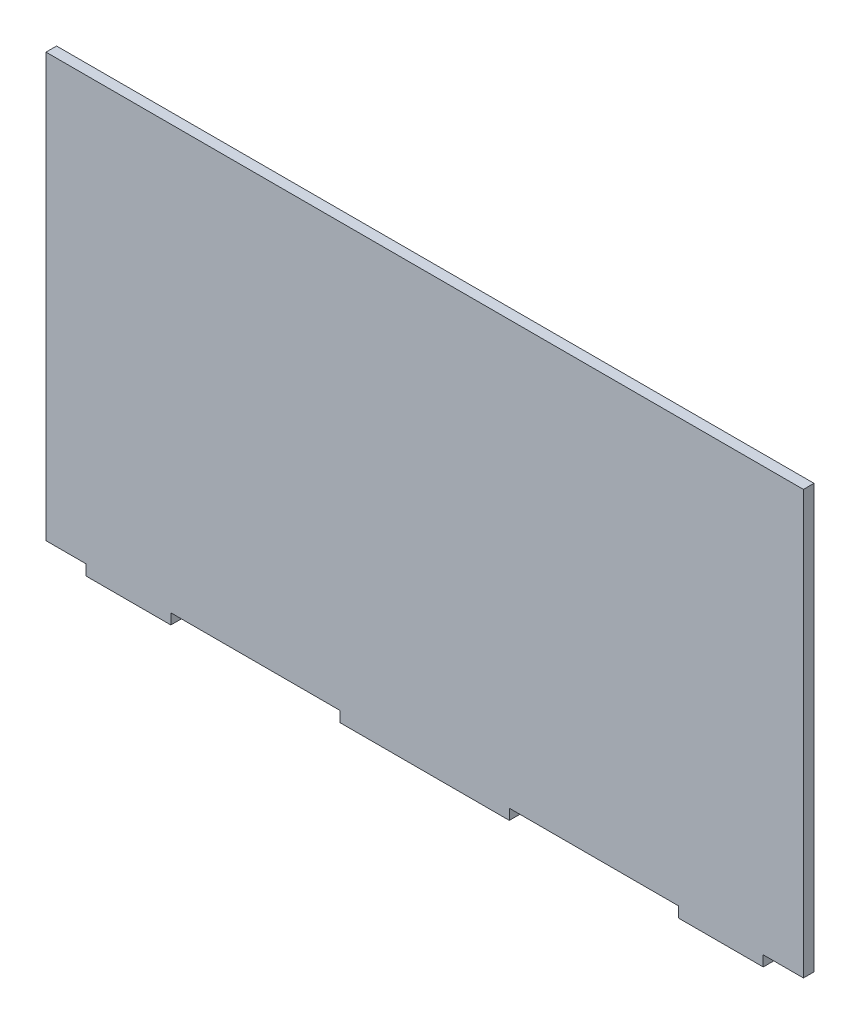
ISO-10303-21;
HEADER;
FILE_DESCRIPTION(('STEP AP214'),'2;1');
FILE_NAME('part.step','',(''),(''),'','','');
FILE_SCHEMA(('AUTOMOTIVE_DESIGN { 1 0 10303 214 1 1 1 1 }'));
ENDSEC;
DATA;
#1=APPLICATION_CONTEXT('core data for automotive mechanical design processes');
#2=APPLICATION_PROTOCOL_DEFINITION('international standard','automotive_design',2000,#1);
#3=PRODUCT_CONTEXT('',#1,'mechanical');
#4=PRODUCT('Part','Part','',(#3));
#5=PRODUCT_RELATED_PRODUCT_CATEGORY('part','',(#4));
#6=PRODUCT_DEFINITION_FORMATION('','',#4);
#7=PRODUCT_DEFINITION_CONTEXT('part definition',#1,'design');
#8=PRODUCT_DEFINITION('design','',#6,#7);
#9=PRODUCT_DEFINITION_SHAPE('','',#8);
#10=(LENGTH_UNIT() NAMED_UNIT(*) SI_UNIT(.MILLI.,.METRE.));
#11=(NAMED_UNIT(*) PLANE_ANGLE_UNIT() SI_UNIT($,.RADIAN.));
#12=(NAMED_UNIT(*) SI_UNIT($,.STERADIAN.) SOLID_ANGLE_UNIT());
#13=UNCERTAINTY_MEASURE_WITH_UNIT(LENGTH_MEASURE(1.E-05),#10,'distance_accuracy_value','');
#14=(GEOMETRIC_REPRESENTATION_CONTEXT(3) GLOBAL_UNCERTAINTY_ASSIGNED_CONTEXT((#13)) GLOBAL_UNIT_ASSIGNED_CONTEXT((#10,
#11,#12)) REPRESENTATION_CONTEXT('',''));
#15=CARTESIAN_POINT('',(0.,0.,0.));
#16=DIRECTION('',(0.,0.,1.));
#17=DIRECTION('',(1.,0.,0.));
#18=AXIS2_PLACEMENT_3D('',#15,#16,#17);
#19=CARTESIAN_POINT('',(-10.8986258338945,0.816744863215092,5.));
#20=DIRECTION('',(1.,0.,0.));
#21=DIRECTION('',(0.,0.,-1.));
#22=AXIS2_PLACEMENT_3D('',#19,#20,#21);
#23=PLANE('',#22);
#24=DIRECTION('',(0.,-1.,0.));
#25=VECTOR('',#24,1.);
#26=CARTESIAN_POINT('',(-10.8986258338945,0.816744863215092,0.));
#27=LINE('',#26,#25);
#28=CARTESIAN_POINT('',(-10.8986258338945,200.816744863215,0.));
#29=VERTEX_POINT('',#28);
#30=CARTESIAN_POINT('',(-10.8986258338945,0.816744863215092,0.));
#31=VERTEX_POINT('',#30);
#32=EDGE_CURVE('E194',#29,#31,#27,.T.);
#33=ORIENTED_EDGE('',*,*,#32,.T.);
#34=DIRECTION('',(0.,0.,-1.));
#35=VECTOR('',#34,1.);
#36=CARTESIAN_POINT('',(-10.8986258338945,0.816744863215092,5.));
#37=LINE('',#36,#35);
#38=CARTESIAN_POINT('',(-10.8986258338945,0.816744863215092,5.));
#39=VERTEX_POINT('',#38);
#40=EDGE_CURVE('E11',#39,#31,#37,.T.);
#41=ORIENTED_EDGE('',*,*,#40,.F.);
#42=DIRECTION('',(0.,-1.,0.));
#43=VECTOR('',#42,1.);
#44=CARTESIAN_POINT('',(-10.8986258338945,0.816744863215092,5.));
#45=LINE('',#44,#43);
#46=CARTESIAN_POINT('',(-10.8986258338945,200.816744863215,5.));
#47=VERTEX_POINT('',#46);
#48=EDGE_CURVE('E240',#47,#39,#45,.T.);
#49=ORIENTED_EDGE('',*,*,#48,.F.);
#50=DIRECTION('',(0.,0.,-1.));
#51=VECTOR('',#50,1.);
#52=CARTESIAN_POINT('',(-10.8986258338945,200.816744863215,5.));
#53=LINE('',#52,#51);
#54=EDGE_CURVE('E190',#47,#29,#53,.T.);
#55=ORIENTED_EDGE('',*,*,#54,.T.);
#56=EDGE_LOOP('',(#33,#41,#49,#55));
#57=FACE_BOUND('',#56,.T.);
#58=ADVANCED_FACE('F45',(#57),#23,.F.);
#59=CARTESIAN_POINT('',(-10.8986258338945,0.816744863215092,5.));
#60=DIRECTION('',(0.,1.,0.));
#61=DIRECTION('',(-1.,0.,0.));
#62=AXIS2_PLACEMENT_3D('',#59,#60,#61);
#63=PLANE('',#62);
#64=DIRECTION('',(1.,0.,0.));
#65=VECTOR('',#64,1.);
#66=CARTESIAN_POINT('',(-10.8986258338945,0.816744863215092,0.));
#67=LINE('',#66,#65);
#68=CARTESIAN_POINT('',(8.10137416610551,0.816744863215092,0.));
#69=VERTEX_POINT('',#68);
#70=EDGE_CURVE('E198',#31,#69,#67,.T.);
#71=ORIENTED_EDGE('',*,*,#70,.T.);
#72=DIRECTION('',(0.,0.,-1.));
#73=VECTOR('',#72,1.);
#74=CARTESIAN_POINT('',(8.10137416610551,0.816744863215092,5.));
#75=LINE('',#74,#73);
#76=CARTESIAN_POINT('',(8.10137416610551,0.816744863215092,5.));
#77=VERTEX_POINT('',#76);
#78=EDGE_CURVE('E54',#77,#69,#75,.T.);
#79=ORIENTED_EDGE('',*,*,#78,.F.);
#80=DIRECTION('',(1.,0.,0.));
#81=VECTOR('',#80,1.);
#82=CARTESIAN_POINT('',(-10.8986258338945,0.816744863215092,5.));
#83=LINE('',#82,#81);
#84=EDGE_CURVE('E129',#39,#77,#83,.T.);
#85=ORIENTED_EDGE('',*,*,#84,.F.);
#86=ORIENTED_EDGE('',*,*,#40,.T.);
#87=EDGE_LOOP('',(#71,#79,#85,#86));
#88=FACE_BOUND('',#87,.T.);
#89=ADVANCED_FACE('F362',(#88),#63,.F.);
#90=CARTESIAN_POINT('',(8.10137416610551,0.816744863215092,5.));
#91=DIRECTION('',(1.,0.,0.));
#92=DIRECTION('',(0.,0.,-1.));
#93=AXIS2_PLACEMENT_3D('',#90,#91,#92);
#94=PLANE('',#93);
#95=DIRECTION('',(0.,-1.,0.));
#96=VECTOR('',#95,1.);
#97=CARTESIAN_POINT('',(8.10137416610551,0.816744863215092,0.));
#98=LINE('',#97,#96);
#99=CARTESIAN_POINT('',(8.10137416610551,-4.18325513678491,0.));
#100=VERTEX_POINT('',#99);
#101=EDGE_CURVE('E201',#69,#100,#98,.T.);
#102=ORIENTED_EDGE('',*,*,#101,.T.);
#103=DIRECTION('',(0.,0.,-1.));
#104=VECTOR('',#103,1.);
#105=CARTESIAN_POINT('',(8.10137416610551,-4.18325513678491,5.));
#106=LINE('',#105,#104);
#107=CARTESIAN_POINT('',(8.10137416610551,-4.18325513678491,5.));
#108=VERTEX_POINT('',#107);
#109=EDGE_CURVE('E283',#108,#100,#106,.T.);
#110=ORIENTED_EDGE('',*,*,#109,.F.);
#111=DIRECTION('',(0.,-1.,0.));
#112=VECTOR('',#111,1.);
#113=CARTESIAN_POINT('',(8.10137416610551,0.816744863215092,5.));
#114=LINE('',#113,#112);
#115=EDGE_CURVE('E293',#77,#108,#114,.T.);
#116=ORIENTED_EDGE('',*,*,#115,.F.);
#117=ORIENTED_EDGE('',*,*,#78,.T.);
#118=EDGE_LOOP('',(#102,#110,#116,#117));
#119=FACE_BOUND('',#118,.T.);
#120=ADVANCED_FACE('F291',(#119),#94,.F.);
#121=CARTESIAN_POINT('',(8.10137416610551,-4.18325513678491,5.));
#122=DIRECTION('',(0.,1.,0.));
#123=DIRECTION('',(0.,0.,1.));
#124=AXIS2_PLACEMENT_3D('',#121,#122,#123);
#125=PLANE('',#124);
#126=DIRECTION('',(1.,0.,0.));
#127=VECTOR('',#126,1.);
#128=CARTESIAN_POINT('',(8.10137416610551,-4.18325513678491,0.));
#129=LINE('',#128,#127);
#130=CARTESIAN_POINT('',(48.1013741661055,-4.18325513678491,0.));
#131=VERTEX_POINT('',#130);
#132=EDGE_CURVE('E204',#100,#131,#129,.T.);
#133=ORIENTED_EDGE('',*,*,#132,.T.);
#134=DIRECTION('',(0.,0.,-1.));
#135=VECTOR('',#134,1.);
#136=CARTESIAN_POINT('',(48.1013741661055,-4.18325513678491,5.));
#137=LINE('',#136,#135);
#138=CARTESIAN_POINT('',(48.1013741661055,-4.18325513678491,5.));
#139=VERTEX_POINT('',#138);
#140=EDGE_CURVE('E279',#139,#131,#137,.T.);
#141=ORIENTED_EDGE('',*,*,#140,.F.);
#142=DIRECTION('',(1.,0.,0.));
#143=VECTOR('',#142,1.);
#144=CARTESIAN_POINT('',(8.10137416610551,-4.18325513678491,5.));
#145=LINE('',#144,#143);
#146=EDGE_CURVE('E312',#108,#139,#145,.T.);
#147=ORIENTED_EDGE('',*,*,#146,.F.);
#148=ORIENTED_EDGE('',*,*,#109,.T.);
#149=EDGE_LOOP('',(#133,#141,#147,#148));
#150=FACE_BOUND('',#149,.T.);
#151=ADVANCED_FACE('F302',(#150),#125,.F.);
#152=CARTESIAN_POINT('',(48.1013741661055,-4.18325513678491,5.));
#153=DIRECTION('',(-1.,0.,0.));
#154=DIRECTION('',(0.,0.,1.));
#155=AXIS2_PLACEMENT_3D('',#152,#153,#154);
#156=PLANE('',#155);
#157=DIRECTION('',(0.,1.,0.));
#158=VECTOR('',#157,1.);
#159=CARTESIAN_POINT('',(48.1013741661055,-4.18325513678491,0.));
#160=LINE('',#159,#158);
#161=CARTESIAN_POINT('',(48.1013741661055,0.816744863215091,0.));
#162=VERTEX_POINT('',#161);
#163=EDGE_CURVE('E207',#131,#162,#160,.T.);
#164=ORIENTED_EDGE('',*,*,#163,.T.);
#165=DIRECTION('',(0.,0.,-1.));
#166=VECTOR('',#165,1.);
#167=CARTESIAN_POINT('',(48.1013741661055,0.816744863215091,5.));
#168=LINE('',#167,#166);
#169=CARTESIAN_POINT('',(48.1013741661055,0.816744863215091,5.));
#170=VERTEX_POINT('',#169);
#171=EDGE_CURVE('E275',#170,#162,#168,.T.);
#172=ORIENTED_EDGE('',*,*,#171,.F.);
#173=DIRECTION('',(0.,1.,0.));
#174=VECTOR('',#173,1.);
#175=CARTESIAN_POINT('',(48.1013741661055,-4.18325513678491,5.));
#176=LINE('',#175,#174);
#177=EDGE_CURVE('E308',#139,#170,#176,.T.);
#178=ORIENTED_EDGE('',*,*,#177,.F.);
#179=ORIENTED_EDGE('',*,*,#140,.T.);
#180=EDGE_LOOP('',(#164,#172,#178,#179));
#181=FACE_BOUND('',#180,.T.);
#182=ADVANCED_FACE('F306',(#181),#156,.F.);
#183=CARTESIAN_POINT('',(48.1013741661055,0.816744863215091,5.));
#184=DIRECTION('',(0.,1.,0.));
#185=DIRECTION('',(0.,0.,1.));
#186=AXIS2_PLACEMENT_3D('',#183,#184,#185);
#187=PLANE('',#186);
#188=DIRECTION('',(1.,0.,0.));
#189=VECTOR('',#188,1.);
#190=CARTESIAN_POINT('',(48.1013741661055,0.816744863215091,0.));
#191=LINE('',#190,#189);
#192=CARTESIAN_POINT('',(128.101374166106,0.816744863215091,0.));
#193=VERTEX_POINT('',#192);
#194=EDGE_CURVE('E210',#162,#193,#191,.T.);
#195=ORIENTED_EDGE('',*,*,#194,.T.);
#196=DIRECTION('',(0.,0.,-1.));
#197=VECTOR('',#196,1.);
#198=CARTESIAN_POINT('',(128.101374166106,0.816744863215091,5.));
#199=LINE('',#198,#197);
#200=CARTESIAN_POINT('',(128.101374166106,0.816744863215091,5.));
#201=VERTEX_POINT('',#200);
#202=EDGE_CURVE('E271',#201,#193,#199,.T.);
#203=ORIENTED_EDGE('',*,*,#202,.F.);
#204=DIRECTION('',(1.,0.,0.));
#205=VECTOR('',#204,1.);
#206=CARTESIAN_POINT('',(48.1013741661055,0.816744863215091,5.));
#207=LINE('',#206,#205);
#208=EDGE_CURVE('E311',#170,#201,#207,.T.);
#209=ORIENTED_EDGE('',*,*,#208,.F.);
#210=ORIENTED_EDGE('',*,*,#171,.T.);
#211=EDGE_LOOP('',(#195,#203,#209,#210));
#212=FACE_BOUND('',#211,.T.);
#213=ADVANCED_FACE('F375',(#212),#187,.F.);
#214=CARTESIAN_POINT('',(128.101374166106,0.816744863215091,5.));
#215=DIRECTION('',(1.,0.,0.));
#216=DIRECTION('',(0.,0.,-1.));
#217=AXIS2_PLACEMENT_3D('',#214,#215,#216);
#218=PLANE('',#217);
#219=DIRECTION('',(0.,-1.,0.));
#220=VECTOR('',#219,1.);
#221=CARTESIAN_POINT('',(128.101374166106,0.816744863215091,0.));
#222=LINE('',#221,#220);
#223=CARTESIAN_POINT('',(128.101374166106,-4.18325513678491,0.));
#224=VERTEX_POINT('',#223);
#225=EDGE_CURVE('E213',#193,#224,#222,.T.);
#226=ORIENTED_EDGE('',*,*,#225,.T.);
#227=DIRECTION('',(0.,0.,-1.));
#228=VECTOR('',#227,1.);
#229=CARTESIAN_POINT('',(128.101374166106,-4.18325513678491,5.));
#230=LINE('',#229,#228);
#231=CARTESIAN_POINT('',(128.101374166106,-4.18325513678491,5.));
#232=VERTEX_POINT('',#231);
#233=EDGE_CURVE('E267',#232,#224,#230,.T.);
#234=ORIENTED_EDGE('',*,*,#233,.F.);
#235=DIRECTION('',(0.,-1.,0.));
#236=VECTOR('',#235,1.);
#237=CARTESIAN_POINT('',(128.101374166106,0.816744863215091,5.));
#238=LINE('',#237,#236);
#239=EDGE_CURVE('E316',#201,#232,#238,.T.);
#240=ORIENTED_EDGE('',*,*,#239,.F.);
#241=ORIENTED_EDGE('',*,*,#202,.T.);
#242=EDGE_LOOP('',(#226,#234,#240,#241));
#243=FACE_BOUND('',#242,.T.);
#244=ADVANCED_FACE('F378',(#243),#218,.F.);
#245=CARTESIAN_POINT('',(128.101374166106,-4.18325513678491,5.));
#246=DIRECTION('',(0.,1.,0.));
#247=DIRECTION('',(0.,0.,1.));
#248=AXIS2_PLACEMENT_3D('',#245,#246,#247);
#249=PLANE('',#248);
#250=DIRECTION('',(1.,0.,0.));
#251=VECTOR('',#250,1.);
#252=CARTESIAN_POINT('',(128.101374166106,-4.18325513678491,0.));
#253=LINE('',#252,#251);
#254=CARTESIAN_POINT('',(208.101374166106,-4.18325513678491,0.));
#255=VERTEX_POINT('',#254);
#256=EDGE_CURVE('E216',#224,#255,#253,.T.);
#257=ORIENTED_EDGE('',*,*,#256,.T.);
#258=DIRECTION('',(0.,0.,-1.));
#259=VECTOR('',#258,1.);
#260=CARTESIAN_POINT('',(208.101374166106,-4.18325513678491,5.));
#261=LINE('',#260,#259);
#262=CARTESIAN_POINT('',(208.101374166106,-4.18325513678491,5.));
#263=VERTEX_POINT('',#262);
#264=EDGE_CURVE('E263',#263,#255,#261,.T.);
#265=ORIENTED_EDGE('',*,*,#264,.F.);
#266=DIRECTION('',(1.,0.,0.));
#267=VECTOR('',#266,1.);
#268=CARTESIAN_POINT('',(128.101374166106,-4.18325513678491,5.));
#269=LINE('',#268,#267);
#270=EDGE_CURVE('E323',#232,#263,#269,.T.);
#271=ORIENTED_EDGE('',*,*,#270,.F.);
#272=ORIENTED_EDGE('',*,*,#233,.T.);
#273=EDGE_LOOP('',(#257,#265,#271,#272));
#274=FACE_BOUND('',#273,.T.);
#275=ADVANCED_FACE('F382',(#274),#249,.F.);
#276=CARTESIAN_POINT('',(208.101374166106,-4.18325513678491,5.));
#277=DIRECTION('',(-1.,0.,0.));
#278=DIRECTION('',(0.,0.,1.));
#279=AXIS2_PLACEMENT_3D('',#276,#277,#278);
#280=PLANE('',#279);
#281=DIRECTION('',(0.,1.,0.));
#282=VECTOR('',#281,1.);
#283=CARTESIAN_POINT('',(208.101374166106,-4.18325513678491,0.));
#284=LINE('',#283,#282);
#285=CARTESIAN_POINT('',(208.101374166106,0.816744863215092,0.));
#286=VERTEX_POINT('',#285);
#287=EDGE_CURVE('E219',#255,#286,#284,.T.);
#288=ORIENTED_EDGE('',*,*,#287,.T.);
#289=DIRECTION('',(0.,0.,-1.));
#290=VECTOR('',#289,1.);
#291=CARTESIAN_POINT('',(208.101374166106,0.816744863215092,5.));
#292=LINE('',#291,#290);
#293=CARTESIAN_POINT('',(208.101374166106,0.816744863215092,5.));
#294=VERTEX_POINT('',#293);
#295=EDGE_CURVE('E259',#294,#286,#292,.T.);
#296=ORIENTED_EDGE('',*,*,#295,.F.);
#297=DIRECTION('',(0.,1.,0.));
#298=VECTOR('',#297,1.);
#299=CARTESIAN_POINT('',(208.101374166106,-4.18325513678491,5.));
#300=LINE('',#299,#298);
#301=EDGE_CURVE('E326',#263,#294,#300,.T.);
#302=ORIENTED_EDGE('',*,*,#301,.F.);
#303=ORIENTED_EDGE('',*,*,#264,.T.);
#304=EDGE_LOOP('',(#288,#296,#302,#303));
#305=FACE_BOUND('',#304,.T.);
#306=ADVANCED_FACE('F386',(#305),#280,.F.);
#307=CARTESIAN_POINT('',(208.101374166106,0.816744863215092,5.));
#308=DIRECTION('',(0.,1.,0.));
#309=DIRECTION('',(0.,0.,1.));
#310=AXIS2_PLACEMENT_3D('',#307,#308,#309);
#311=PLANE('',#310);
#312=DIRECTION('',(1.,0.,0.));
#313=VECTOR('',#312,1.);
#314=CARTESIAN_POINT('',(208.101374166106,0.816744863215092,0.));
#315=LINE('',#314,#313);
#316=CARTESIAN_POINT('',(288.101374166106,0.816744863215092,0.));
#317=VERTEX_POINT('',#316);
#318=EDGE_CURVE('E222',#286,#317,#315,.T.);
#319=ORIENTED_EDGE('',*,*,#318,.T.);
#320=DIRECTION('',(0.,0.,-1.));
#321=VECTOR('',#320,1.);
#322=CARTESIAN_POINT('',(288.101374166106,0.816744863215092,5.));
#323=LINE('',#322,#321);
#324=CARTESIAN_POINT('',(288.101374166106,0.816744863215092,5.));
#325=VERTEX_POINT('',#324);
#326=EDGE_CURVE('E255',#325,#317,#323,.T.);
#327=ORIENTED_EDGE('',*,*,#326,.F.);
#328=DIRECTION('',(1.,0.,0.));
#329=VECTOR('',#328,1.);
#330=CARTESIAN_POINT('',(208.101374166106,0.816744863215092,5.));
#331=LINE('',#330,#329);
#332=EDGE_CURVE('E329',#294,#325,#331,.T.);
#333=ORIENTED_EDGE('',*,*,#332,.F.);
#334=ORIENTED_EDGE('',*,*,#295,.T.);
#335=EDGE_LOOP('',(#319,#327,#333,#334));
#336=FACE_BOUND('',#335,.T.);
#337=ADVANCED_FACE('F390',(#336),#311,.F.);
#338=CARTESIAN_POINT('',(288.101374166106,0.816744863215092,5.));
#339=DIRECTION('',(1.,0.,0.));
#340=DIRECTION('',(0.,0.,-1.));
#341=AXIS2_PLACEMENT_3D('',#338,#339,#340);
#342=PLANE('',#341);
#343=DIRECTION('',(0.,-1.,0.));
#344=VECTOR('',#343,1.);
#345=CARTESIAN_POINT('',(288.101374166106,0.816744863215092,0.));
#346=LINE('',#345,#344);
#347=CARTESIAN_POINT('',(288.101374166106,-4.18325513678491,0.));
#348=VERTEX_POINT('',#347);
#349=EDGE_CURVE('E225',#317,#348,#346,.T.);
#350=ORIENTED_EDGE('',*,*,#349,.T.);
#351=DIRECTION('',(0.,0.,-1.));
#352=VECTOR('',#351,1.);
#353=CARTESIAN_POINT('',(288.101374166106,-4.18325513678491,5.));
#354=LINE('',#353,#352);
#355=CARTESIAN_POINT('',(288.101374166106,-4.18325513678491,5.));
#356=VERTEX_POINT('',#355);
#357=EDGE_CURVE('E251',#356,#348,#354,.T.);
#358=ORIENTED_EDGE('',*,*,#357,.F.);
#359=DIRECTION('',(0.,-1.,0.));
#360=VECTOR('',#359,1.);
#361=CARTESIAN_POINT('',(288.101374166106,0.816744863215092,5.));
#362=LINE('',#361,#360);
#363=EDGE_CURVE('E332',#325,#356,#362,.T.);
#364=ORIENTED_EDGE('',*,*,#363,.F.);
#365=ORIENTED_EDGE('',*,*,#326,.T.);
#366=EDGE_LOOP('',(#350,#358,#364,#365));
#367=FACE_BOUND('',#366,.T.);
#368=ADVANCED_FACE('F394',(#367),#342,.F.);
#369=CARTESIAN_POINT('',(288.101374166106,-4.18325513678491,5.));
#370=DIRECTION('',(0.,1.,0.));
#371=DIRECTION('',(0.,0.,1.));
#372=AXIS2_PLACEMENT_3D('',#369,#370,#371);
#373=PLANE('',#372);
#374=DIRECTION('',(1.,0.,0.));
#375=VECTOR('',#374,1.);
#376=CARTESIAN_POINT('',(288.101374166106,-4.18325513678491,0.));
#377=LINE('',#376,#375);
#378=CARTESIAN_POINT('',(328.101374166106,-4.18325513678491,0.));
#379=VERTEX_POINT('',#378);
#380=EDGE_CURVE('E228',#348,#379,#377,.T.);
#381=ORIENTED_EDGE('',*,*,#380,.T.);
#382=DIRECTION('',(0.,0.,-1.));
#383=VECTOR('',#382,1.);
#384=CARTESIAN_POINT('',(328.101374166106,-4.18325513678491,5.));
#385=LINE('',#384,#383);
#386=CARTESIAN_POINT('',(328.101374166106,-4.18325513678491,5.));
#387=VERTEX_POINT('',#386);
#388=EDGE_CURVE('E247',#387,#379,#385,.T.);
#389=ORIENTED_EDGE('',*,*,#388,.F.);
#390=DIRECTION('',(1.,0.,0.));
#391=VECTOR('',#390,1.);
#392=CARTESIAN_POINT('',(288.101374166106,-4.18325513678491,5.));
#393=LINE('',#392,#391);
#394=EDGE_CURVE('E335',#356,#387,#393,.T.);
#395=ORIENTED_EDGE('',*,*,#394,.F.);
#396=ORIENTED_EDGE('',*,*,#357,.T.);
#397=EDGE_LOOP('',(#381,#389,#395,#396));
#398=FACE_BOUND('',#397,.T.);
#399=ADVANCED_FACE('F343',(#398),#373,.F.);
#400=CARTESIAN_POINT('',(328.101374166106,-4.18325513678491,5.));
#401=DIRECTION('',(-1.,0.,0.));
#402=DIRECTION('',(0.,0.,1.));
#403=AXIS2_PLACEMENT_3D('',#400,#401,#402);
#404=PLANE('',#403);
#405=DIRECTION('',(0.,1.,0.));
#406=VECTOR('',#405,1.);
#407=CARTESIAN_POINT('',(328.101374166106,-4.18325513678491,0.));
#408=LINE('',#407,#406);
#409=CARTESIAN_POINT('',(328.101374166106,0.816744863215092,0.));
#410=VERTEX_POINT('',#409);
#411=EDGE_CURVE('E231',#379,#410,#408,.T.);
#412=ORIENTED_EDGE('',*,*,#411,.T.);
#413=DIRECTION('',(0.,0.,-1.));
#414=VECTOR('',#413,1.);
#415=CARTESIAN_POINT('',(328.101374166106,0.816744863215092,5.));
#416=LINE('',#415,#414);
#417=CARTESIAN_POINT('',(328.101374166106,0.816744863215092,5.));
#418=VERTEX_POINT('',#417);
#419=EDGE_CURVE('E183',#418,#410,#416,.T.);
#420=ORIENTED_EDGE('',*,*,#419,.F.);
#421=DIRECTION('',(0.,1.,0.));
#422=VECTOR('',#421,1.);
#423=CARTESIAN_POINT('',(328.101374166106,-4.18325513678491,5.));
#424=LINE('',#423,#422);
#425=EDGE_CURVE('E172',#387,#418,#424,.T.);
#426=ORIENTED_EDGE('',*,*,#425,.F.);
#427=ORIENTED_EDGE('',*,*,#388,.T.);
#428=EDGE_LOOP('',(#412,#420,#426,#427));
#429=FACE_BOUND('',#428,.T.);
#430=ADVANCED_FACE('F347',(#429),#404,.F.);
#431=CARTESIAN_POINT('',(328.101374166106,0.816744863215092,5.));
#432=DIRECTION('',(0.,1.,0.));
#433=DIRECTION('',(0.,0.,1.));
#434=AXIS2_PLACEMENT_3D('',#431,#432,#433);
#435=PLANE('',#434);
#436=DIRECTION('',(1.,0.,0.));
#437=VECTOR('',#436,1.);
#438=CARTESIAN_POINT('',(328.101374166106,0.816744863215092,0.));
#439=LINE('',#438,#437);
#440=CARTESIAN_POINT('',(347.101374166106,0.816744863215092,0.));
#441=VERTEX_POINT('',#440);
#442=EDGE_CURVE('E181',#410,#441,#439,.T.);
#443=ORIENTED_EDGE('',*,*,#442,.T.);
#444=DIRECTION('',(0.,0.,-1.));
#445=VECTOR('',#444,1.);
#446=CARTESIAN_POINT('',(347.101374166106,0.816744863215092,5.));
#447=LINE('',#446,#445);
#448=CARTESIAN_POINT('',(347.101374166106,0.816744863215092,5.));
#449=VERTEX_POINT('',#448);
#450=EDGE_CURVE('E178',#449,#441,#447,.T.);
#451=ORIENTED_EDGE('',*,*,#450,.F.);
#452=DIRECTION('',(1.,0.,0.));
#453=VECTOR('',#452,1.);
#454=CARTESIAN_POINT('',(328.101374166106,0.816744863215092,5.));
#455=LINE('',#454,#453);
#456=EDGE_CURVE('E166',#418,#449,#455,.T.);
#457=ORIENTED_EDGE('',*,*,#456,.F.);
#458=ORIENTED_EDGE('',*,*,#419,.T.);
#459=EDGE_LOOP('',(#443,#451,#457,#458));
#460=FACE_BOUND('',#459,.T.);
#461=ADVANCED_FACE('F179',(#460),#435,.F.);
#462=CARTESIAN_POINT('',(347.101374166106,200.816744863215,5.));
#463=DIRECTION('',(-1.,0.,0.));
#464=DIRECTION('',(0.,0.,1.));
#465=AXIS2_PLACEMENT_3D('',#462,#463,#464);
#466=PLANE('',#465);
#467=DIRECTION('',(0.,1.,0.));
#468=VECTOR('',#467,1.);
#469=CARTESIAN_POINT('',(347.101374166106,200.816744863215,0.));
#470=LINE('',#469,#468);
#471=CARTESIAN_POINT('',(347.101374166106,200.816744863215,0.));
#472=VERTEX_POINT('',#471);
#473=EDGE_CURVE('E115',#441,#472,#470,.T.);
#474=ORIENTED_EDGE('',*,*,#473,.T.);
#475=DIRECTION('',(0.,0.,-1.));
#476=VECTOR('',#475,1.);
#477=CARTESIAN_POINT('',(347.101374166106,200.816744863215,5.));
#478=LINE('',#477,#476);
#479=CARTESIAN_POINT('',(347.101374166106,200.816744863215,5.));
#480=VERTEX_POINT('',#479);
#481=EDGE_CURVE('E184',#480,#472,#478,.T.);
#482=ORIENTED_EDGE('',*,*,#481,.F.);
#483=DIRECTION('',(0.,1.,0.));
#484=VECTOR('',#483,1.);
#485=CARTESIAN_POINT('',(347.101374166106,200.816744863215,5.));
#486=LINE('',#485,#484);
#487=EDGE_CURVE('E170',#449,#480,#486,.T.);
#488=ORIENTED_EDGE('',*,*,#487,.F.);
#489=ORIENTED_EDGE('',*,*,#450,.T.);
#490=EDGE_LOOP('',(#474,#482,#488,#489));
#491=FACE_BOUND('',#490,.T.);
#492=ADVANCED_FACE('F186',(#491),#466,.F.);
#493=CARTESIAN_POINT('',(-10.8986258338945,200.816744863215,5.));
#494=DIRECTION('',(0.,-1.,0.));
#495=DIRECTION('',(0.,0.,-1.));
#496=AXIS2_PLACEMENT_3D('',#493,#494,#495);
#497=PLANE('',#496);
#498=DIRECTION('',(-1.,0.,0.));
#499=VECTOR('',#498,1.);
#500=CARTESIAN_POINT('',(-10.8986258338945,200.816744863215,0.));
#501=LINE('',#500,#499);
#502=EDGE_CURVE('E121',#472,#29,#501,.T.);
#503=ORIENTED_EDGE('',*,*,#502,.T.);
#504=ORIENTED_EDGE('',*,*,#54,.F.);
#505=DIRECTION('',(-1.,0.,0.));
#506=VECTOR('',#505,1.);
#507=CARTESIAN_POINT('',(-10.8986258338945,200.816744863215,5.));
#508=LINE('',#507,#506);
#509=EDGE_CURVE('E62',#480,#47,#508,.T.);
#510=ORIENTED_EDGE('',*,*,#509,.F.);
#511=ORIENTED_EDGE('',*,*,#481,.T.);
#512=EDGE_LOOP('',(#503,#504,#510,#511));
#513=FACE_BOUND('',#512,.T.);
#514=ADVANCED_FACE('F351',(#513),#497,.F.);
#515=CARTESIAN_POINT('',(0.,0.,5.));
#516=DIRECTION('',(0.,0.,-1.));
#517=DIRECTION('',(-1.,0.,0.));
#518=AXIS2_PLACEMENT_3D('',#515,#516,#517);
#519=PLANE('',#518);
#520=ORIENTED_EDGE('',*,*,#48,.T.);
#521=ORIENTED_EDGE('',*,*,#84,.T.);
#522=ORIENTED_EDGE('',*,*,#115,.T.);
#523=ORIENTED_EDGE('',*,*,#146,.T.);
#524=ORIENTED_EDGE('',*,*,#177,.T.);
#525=ORIENTED_EDGE('',*,*,#208,.T.);
#526=ORIENTED_EDGE('',*,*,#239,.T.);
#527=ORIENTED_EDGE('',*,*,#270,.T.);
#528=ORIENTED_EDGE('',*,*,#301,.T.);
#529=ORIENTED_EDGE('',*,*,#332,.T.);
#530=ORIENTED_EDGE('',*,*,#363,.T.);
#531=ORIENTED_EDGE('',*,*,#394,.T.);
#532=ORIENTED_EDGE('',*,*,#425,.T.);
#533=ORIENTED_EDGE('',*,*,#456,.T.);
#534=ORIENTED_EDGE('',*,*,#487,.T.);
#535=ORIENTED_EDGE('',*,*,#509,.T.);
#536=EDGE_LOOP('',(#520,#521,#522,#523,#524,#525,#526,#527,#528,#529,#530,#531,#532,#533,#534,#535));
#537=FACE_BOUND('',#536,.T.);
#538=ADVANCED_FACE('F168',(#537),#519,.F.);
#539=CARTESIAN_POINT('',(0.,0.,0.));
#540=DIRECTION('',(0.,0.,-1.));
#541=DIRECTION('',(-1.,0.,0.));
#542=AXIS2_PLACEMENT_3D('',#539,#540,#541);
#543=PLANE('',#542);
#544=ORIENTED_EDGE('',*,*,#32,.F.);
#545=ORIENTED_EDGE('',*,*,#502,.F.);
#546=ORIENTED_EDGE('',*,*,#473,.F.);
#547=ORIENTED_EDGE('',*,*,#442,.F.);
#548=ORIENTED_EDGE('',*,*,#411,.F.);
#549=ORIENTED_EDGE('',*,*,#380,.F.);
#550=ORIENTED_EDGE('',*,*,#349,.F.);
#551=ORIENTED_EDGE('',*,*,#318,.F.);
#552=ORIENTED_EDGE('',*,*,#287,.F.);
#553=ORIENTED_EDGE('',*,*,#256,.F.);
#554=ORIENTED_EDGE('',*,*,#225,.F.);
#555=ORIENTED_EDGE('',*,*,#194,.F.);
#556=ORIENTED_EDGE('',*,*,#163,.F.);
#557=ORIENTED_EDGE('',*,*,#132,.F.);
#558=ORIENTED_EDGE('',*,*,#101,.F.);
#559=ORIENTED_EDGE('',*,*,#70,.F.);
#560=EDGE_LOOP('',(#544,#545,#546,#547,#548,#549,#550,#551,#552,#553,#554,#555,#556,#557,#558,#559));
#561=FACE_BOUND('',#560,.T.);
#562=ADVANCED_FACE('F297',(#561),#543,.T.);
#563=CLOSED_SHELL('',(#58,#89,#120,#151,#182,#213,#244,#275,#306,#337,#368,#399,#430,#461,#492,
#514,#538,#562));
#564=MANIFOLD_SOLID_BREP('B2',#563);
#565=ADVANCED_BREP_SHAPE_REPRESENTATION('',(#18,#564),#14);
#566=SHAPE_DEFINITION_REPRESENTATION(#9,#565);
ENDSEC;
END-ISO-10303-21;
